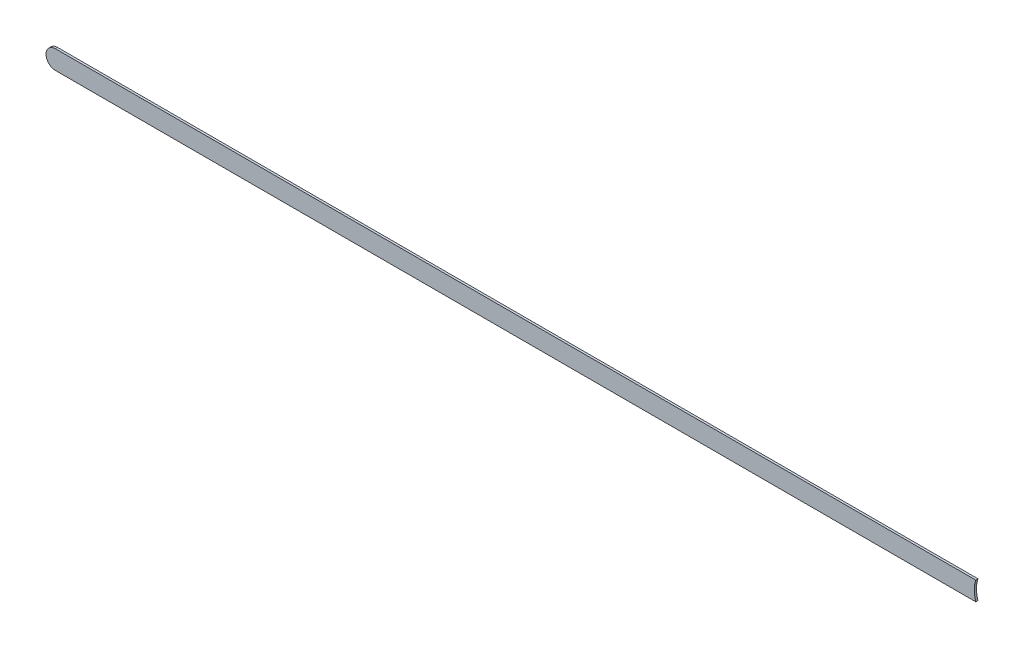
ISO-10303-21;
HEADER;
FILE_DESCRIPTION(('STEP AP214'),'2;1');
FILE_NAME('part.step','',(''),(''),'','','');
FILE_SCHEMA(('AUTOMOTIVE_DESIGN { 1 0 10303 214 1 1 1 1 }'));
ENDSEC;
DATA;
#1=APPLICATION_CONTEXT('core data for automotive mechanical design processes');
#2=APPLICATION_PROTOCOL_DEFINITION('international standard','automotive_design',2000,#1);
#3=PRODUCT_CONTEXT('',#1,'mechanical');
#4=PRODUCT('Part','Part','',(#3));
#5=PRODUCT_RELATED_PRODUCT_CATEGORY('part','',(#4));
#6=PRODUCT_DEFINITION_FORMATION('','',#4);
#7=PRODUCT_DEFINITION_CONTEXT('part definition',#1,'design');
#8=PRODUCT_DEFINITION('design','',#6,#7);
#9=PRODUCT_DEFINITION_SHAPE('','',#8);
#10=(LENGTH_UNIT() NAMED_UNIT(*) SI_UNIT(.MILLI.,.METRE.));
#11=(NAMED_UNIT(*) PLANE_ANGLE_UNIT() SI_UNIT($,.RADIAN.));
#12=(NAMED_UNIT(*) SI_UNIT($,.STERADIAN.) SOLID_ANGLE_UNIT());
#13=UNCERTAINTY_MEASURE_WITH_UNIT(LENGTH_MEASURE(1.E-05),#10,'distance_accuracy_value','');
#14=(GEOMETRIC_REPRESENTATION_CONTEXT(3) GLOBAL_UNCERTAINTY_ASSIGNED_CONTEXT((#13)) GLOBAL_UNIT_ASSIGNED_CONTEXT((#10,
#11,#12)) REPRESENTATION_CONTEXT('',''));
#15=CARTESIAN_POINT('',(0.,0.,0.));
#16=DIRECTION('',(0.,0.,1.));
#17=DIRECTION('',(1.,0.,0.));
#18=AXIS2_PLACEMENT_3D('',#15,#16,#17);
#19=CARTESIAN_POINT('',(151.345,-68.27,1.6));
#20=DIRECTION('',(0.,-1.,0.));
#21=DIRECTION('',(0.,0.,-1.));
#22=AXIS2_PLACEMENT_3D('',#19,#20,#21);
#23=PLANE('',#22);
#24=DIRECTION('',(0.,0.,1.));
#25=VECTOR('',#24,1.);
#26=CARTESIAN_POINT('',(136.24,-68.27,1.6));
#27=LINE('',#26,#25);
#28=CARTESIAN_POINT('',(136.24,-68.27,1.6));
#29=VERTEX_POINT('',#28);
#30=CARTESIAN_POINT('',(136.24,-68.27,1.635));
#31=VERTEX_POINT('',#30);
#32=EDGE_CURVE('E11',#29,#31,#27,.T.);
#33=ORIENTED_EDGE('',*,*,#32,.T.);
#34=DIRECTION('',(-1.,0.,0.));
#35=VECTOR('',#34,1.);
#36=CARTESIAN_POINT('',(151.345,-68.27,1.635));
#37=LINE('',#36,#35);
#38=CARTESIAN_POINT('',(150.89430609057,-68.27,1.635));
#39=VERTEX_POINT('',#38);
#40=EDGE_CURVE('E20',#39,#31,#37,.T.);
#41=ORIENTED_EDGE('',*,*,#40,.F.);
#42=DIRECTION('',(0.,0.,-1.));
#43=VECTOR('',#42,1.);
#44=CARTESIAN_POINT('',(150.89430609056,-68.27,-0.045));
#45=LINE('',#44,#43);
#46=CARTESIAN_POINT('',(150.89430609057,-68.27,1.6));
#47=VERTEX_POINT('',#46);
#48=EDGE_CURVE('E53',#39,#47,#45,.T.);
#49=ORIENTED_EDGE('',*,*,#48,.T.);
#50=DIRECTION('',(-1.,0.,0.));
#51=VECTOR('',#50,1.);
#52=CARTESIAN_POINT('',(151.345,-68.27,1.6));
#53=LINE('',#52,#51);
#54=EDGE_CURVE('E107',#47,#29,#53,.T.);
#55=ORIENTED_EDGE('',*,*,#54,.T.);
#56=EDGE_LOOP('',(#33,#41,#49,#55));
#57=FACE_BOUND('',#56,.T.);
#58=ADVANCED_FACE('F17',(#57),#23,.F.);
#59=CARTESIAN_POINT('',(136.24,-68.42,1.6));
#60=DIRECTION('',(0.,0.,-1.));
#61=DIRECTION('',(0.,1.,0.));
#62=AXIS2_PLACEMENT_3D('',#59,#60,#61);
#63=CYLINDRICAL_SURFACE('',#62,0.15);
#64=CARTESIAN_POINT('',(136.24,-68.42,1.6));
#65=DIRECTION('',(0.,0.,1.));
#66=DIRECTION('',(0.,1.,0.));
#67=AXIS2_PLACEMENT_3D('',#64,#65,#66);
#68=CIRCLE('',#67,0.15);
#69=CARTESIAN_POINT('',(136.24,-68.57,1.6));
#70=VERTEX_POINT('',#69);
#71=EDGE_CURVE('E59',#29,#70,#68,.T.);
#72=ORIENTED_EDGE('',*,*,#71,.T.);
#73=DIRECTION('',(0.,0.,1.));
#74=VECTOR('',#73,1.);
#75=CARTESIAN_POINT('',(136.24,-68.57,1.6));
#76=LINE('',#75,#74);
#77=CARTESIAN_POINT('',(136.24,-68.57,1.635));
#78=VERTEX_POINT('',#77);
#79=EDGE_CURVE('E91',#70,#78,#76,.T.);
#80=ORIENTED_EDGE('',*,*,#79,.T.);
#81=CARTESIAN_POINT('',(136.24,-68.42,1.635));
#82=DIRECTION('',(0.,0.,1.));
#83=DIRECTION('',(0.,1.,0.));
#84=AXIS2_PLACEMENT_3D('',#81,#82,#83);
#85=CIRCLE('',#84,0.15);
#86=EDGE_CURVE('E87',#31,#78,#85,.T.);
#87=ORIENTED_EDGE('',*,*,#86,.F.);
#88=ORIENTED_EDGE('',*,*,#32,.F.);
#89=EDGE_LOOP('',(#72,#80,#87,#88));
#90=FACE_BOUND('',#89,.T.);
#91=ADVANCED_FACE('F121',(#90),#63,.T.);
#92=CARTESIAN_POINT('',(136.24,-68.57,1.635));
#93=DIRECTION('',(0.,0.,1.));
#94=DIRECTION('',(1.,0.,0.));
#95=AXIS2_PLACEMENT_3D('',#92,#93,#94);
#96=PLANE('',#95);
#97=ORIENTED_EDGE('',*,*,#86,.T.);
#98=DIRECTION('',(1.,0.,0.));
#99=VECTOR('',#98,1.);
#100=CARTESIAN_POINT('',(136.24,-68.57,1.635));
#101=LINE('',#100,#99);
#102=CARTESIAN_POINT('',(150.89430609056,-68.57,1.635));
#103=VERTEX_POINT('',#102);
#104=EDGE_CURVE('E85',#78,#103,#101,.T.);
#105=ORIENTED_EDGE('',*,*,#104,.T.);
#106=CARTESIAN_POINT('',(151.345,-68.42,1.635));
#107=DIRECTION('',(0.,0.,-1.));
#108=DIRECTION('',(0.,-1.,0.));
#109=AXIS2_PLACEMENT_3D('',#106,#107,#108);
#110=CIRCLE('',#109,0.475);
#111=EDGE_CURVE('E76',#103,#39,#110,.T.);
#112=ORIENTED_EDGE('',*,*,#111,.T.);
#113=ORIENTED_EDGE('',*,*,#40,.T.);
#114=EDGE_LOOP('',(#97,#105,#112,#113));
#115=FACE_BOUND('',#114,.T.);
#116=ADVANCED_FACE('F86',(#115),#96,.T.);
#117=CARTESIAN_POINT('',(151.345,-68.42,-0.045));
#118=DIRECTION('',(0.,0.,-1.));
#119=DIRECTION('',(0.,-1.,0.));
#120=AXIS2_PLACEMENT_3D('',#117,#118,#119);
#121=CYLINDRICAL_SURFACE('',#120,0.475);
#122=ORIENTED_EDGE('',*,*,#111,.F.);
#123=DIRECTION('',(0.,0.,-1.));
#124=VECTOR('',#123,1.);
#125=CARTESIAN_POINT('',(150.89430609056,-68.57,-0.045));
#126=LINE('',#125,#124);
#127=CARTESIAN_POINT('',(150.89430609056,-68.57,1.6));
#128=VERTEX_POINT('',#127);
#129=EDGE_CURVE('E80',#103,#128,#126,.T.);
#130=ORIENTED_EDGE('',*,*,#129,.T.);
#131=CARTESIAN_POINT('',(151.345,-68.42,1.6));
#132=DIRECTION('',(0.,0.,-1.));
#133=DIRECTION('',(0.,-1.,0.));
#134=AXIS2_PLACEMENT_3D('',#131,#132,#133);
#135=CIRCLE('',#134,0.475);
#136=EDGE_CURVE('E110',#128,#47,#135,.T.);
#137=ORIENTED_EDGE('',*,*,#136,.T.);
#138=ORIENTED_EDGE('',*,*,#48,.F.);
#139=EDGE_LOOP('',(#122,#130,#137,#138));
#140=FACE_BOUND('',#139,.T.);
#141=ADVANCED_FACE('F78',(#140),#121,.F.);
#142=CARTESIAN_POINT('',(136.24,-68.57,1.6));
#143=DIRECTION('',(0.,0.,1.));
#144=DIRECTION('',(1.,0.,0.));
#145=AXIS2_PLACEMENT_3D('',#142,#143,#144);
#146=PLANE('',#145);
#147=ORIENTED_EDGE('',*,*,#54,.F.);
#148=ORIENTED_EDGE('',*,*,#136,.F.);
#149=DIRECTION('',(1.,0.,0.));
#150=VECTOR('',#149,1.);
#151=CARTESIAN_POINT('',(136.24,-68.57,1.6));
#152=LINE('',#151,#150);
#153=EDGE_CURVE('E95',#70,#128,#152,.T.);
#154=ORIENTED_EDGE('',*,*,#153,.F.);
#155=ORIENTED_EDGE('',*,*,#71,.F.);
#156=EDGE_LOOP('',(#147,#148,#154,#155));
#157=FACE_BOUND('',#156,.T.);
#158=ADVANCED_FACE('F132',(#157),#146,.F.);
#159=CARTESIAN_POINT('',(136.24,-68.57,1.6));
#160=DIRECTION('',(0.,1.,0.));
#161=DIRECTION('',(1.,0.,0.));
#162=AXIS2_PLACEMENT_3D('',#159,#160,#161);
#163=PLANE('',#162);
#164=ORIENTED_EDGE('',*,*,#129,.F.);
#165=ORIENTED_EDGE('',*,*,#104,.F.);
#166=ORIENTED_EDGE('',*,*,#79,.F.);
#167=ORIENTED_EDGE('',*,*,#153,.T.);
#168=EDGE_LOOP('',(#164,#165,#166,#167));
#169=FACE_BOUND('',#168,.T.);
#170=ADVANCED_FACE('F94',(#169),#163,.F.);
#171=CLOSED_SHELL('',(#58,#91,#116,#141,#158,#170));
#172=MANIFOLD_SOLID_BREP('B1',#171);
#173=ADVANCED_BREP_SHAPE_REPRESENTATION('',(#18,#172),#14);
#174=SHAPE_DEFINITION_REPRESENTATION(#9,#173);
ENDSEC;
END-ISO-10303-21;
